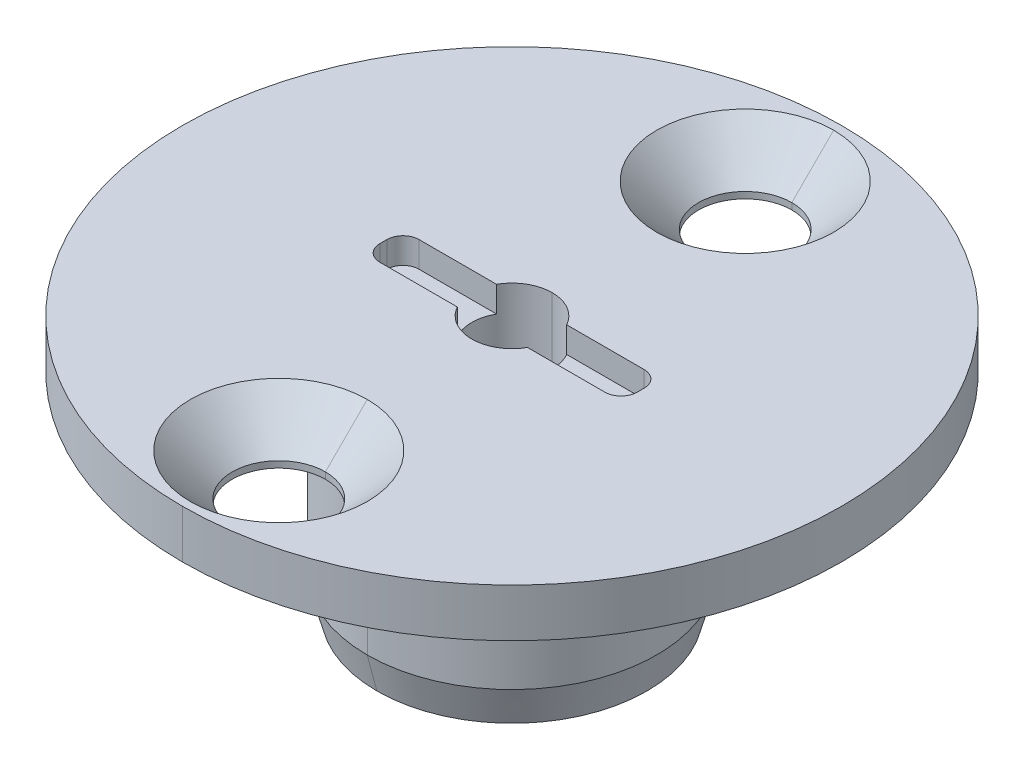
ISO-10303-21;
HEADER;
FILE_DESCRIPTION(('STEP AP214'),'2;1');
FILE_NAME('part.step','',(''),(''),'','','');
FILE_SCHEMA(('AUTOMOTIVE_DESIGN { 1 0 10303 214 1 1 1 1 }'));
ENDSEC;
DATA;
#1=APPLICATION_CONTEXT('core data for automotive mechanical design processes');
#2=APPLICATION_PROTOCOL_DEFINITION('international standard','automotive_design',2000,#1);
#3=PRODUCT_CONTEXT('',#1,'mechanical');
#4=PRODUCT('Part','Part','',(#3));
#5=PRODUCT_RELATED_PRODUCT_CATEGORY('part','',(#4));
#6=PRODUCT_DEFINITION_FORMATION('','',#4);
#7=PRODUCT_DEFINITION_CONTEXT('part definition',#1,'design');
#8=PRODUCT_DEFINITION('design','',#6,#7);
#9=PRODUCT_DEFINITION_SHAPE('','',#8);
#10=(LENGTH_UNIT() NAMED_UNIT(*) SI_UNIT(.MILLI.,.METRE.));
#11=(NAMED_UNIT(*) PLANE_ANGLE_UNIT() SI_UNIT($,.RADIAN.));
#12=(NAMED_UNIT(*) SI_UNIT($,.STERADIAN.) SOLID_ANGLE_UNIT());
#13=UNCERTAINTY_MEASURE_WITH_UNIT(LENGTH_MEASURE(1.E-05),#10,'distance_accuracy_value','');
#14=(GEOMETRIC_REPRESENTATION_CONTEXT(3) GLOBAL_UNCERTAINTY_ASSIGNED_CONTEXT((#13)) GLOBAL_UNIT_ASSIGNED_CONTEXT((#10,
#11,#12)) REPRESENTATION_CONTEXT('',''));
#15=CARTESIAN_POINT('',(0.,0.,0.));
#16=DIRECTION('',(0.,0.,1.));
#17=DIRECTION('',(1.,0.,0.));
#18=AXIS2_PLACEMENT_3D('',#15,#16,#17);
#19=CARTESIAN_POINT('',(0.,8.,0.));
#20=DIRECTION('',(0.,1.,0.));
#21=DIRECTION('',(0.,0.,1.));
#22=AXIS2_PLACEMENT_3D('',#19,#20,#21);
#23=CYLINDRICAL_SURFACE('',#22,1.25);
#24=CARTESIAN_POINT('',(0.,6.,0.));
#25=DIRECTION('',(0.,-1.,0.));
#26=DIRECTION('',(0.,0.,-1.));
#27=AXIS2_PLACEMENT_3D('',#24,#25,#26);
#28=CIRCLE('',#27,1.25);
#29=CARTESIAN_POINT('',(0.,6.,1.25));
#30=VERTEX_POINT('',#29);
#31=CARTESIAN_POINT('',(0.,6.,-1.25));
#32=VERTEX_POINT('',#31);
#33=EDGE_CURVE('E11',#30,#32,#28,.T.);
#34=ORIENTED_EDGE('',*,*,#33,.T.);
#35=DIRECTION('',(0.,1.,0.));
#36=VECTOR('',#35,1.);
#37=CARTESIAN_POINT('',(0.,8.,-1.25));
#38=LINE('',#37,#36);
#39=CARTESIAN_POINT('',(0.,8.,-1.25));
#40=VERTEX_POINT('',#39);
#41=EDGE_CURVE('E27',#32,#40,#38,.T.);
#42=ORIENTED_EDGE('',*,*,#41,.T.);
#43=CARTESIAN_POINT('',(0.,8.,0.));
#44=DIRECTION('',(0.,1.,0.));
#45=DIRECTION('',(0.,0.,1.));
#46=AXIS2_PLACEMENT_3D('',#43,#44,#45);
#47=CIRCLE('',#46,1.25);
#48=CARTESIAN_POINT('',(-1.09105453575887,8.,-0.61));
#49=VERTEX_POINT('',#48);
#50=EDGE_CURVE('E340',#40,#49,#47,.T.);
#51=ORIENTED_EDGE('',*,*,#50,.T.);
#52=DIRECTION('',(0.,-1.,0.));
#53=VECTOR('',#52,1.);
#54=CARTESIAN_POINT('',(-1.09105453575887,8.,-0.61));
#55=LINE('',#54,#53);
#56=CARTESIAN_POINT('',(-1.09105453575887,7.2,-0.61));
#57=VERTEX_POINT('',#56);
#58=EDGE_CURVE('E285',#49,#57,#55,.T.);
#59=ORIENTED_EDGE('',*,*,#58,.T.);
#60=CARTESIAN_POINT('',(0.,7.2,0.));
#61=DIRECTION('',(0.,-1.,0.));
#62=DIRECTION('',(0.,0.,1.));
#63=AXIS2_PLACEMENT_3D('',#60,#61,#62);
#64=CIRCLE('',#63,1.25);
#65=CARTESIAN_POINT('',(-1.09105453575887,7.2,0.61));
#66=VERTEX_POINT('',#65);
#67=EDGE_CURVE('E280',#66,#57,#64,.T.);
#68=ORIENTED_EDGE('',*,*,#67,.F.);
#69=DIRECTION('',(0.,1.,0.));
#70=VECTOR('',#69,1.);
#71=CARTESIAN_POINT('',(-1.09105453575887,8.,0.61));
#72=LINE('',#71,#70);
#73=CARTESIAN_POINT('',(-1.09105453575887,8.,0.61));
#74=VERTEX_POINT('',#73);
#75=EDGE_CURVE('E274',#66,#74,#72,.T.);
#76=ORIENTED_EDGE('',*,*,#75,.T.);
#77=CARTESIAN_POINT('',(0.,8.,0.));
#78=DIRECTION('',(0.,1.,0.));
#79=DIRECTION('',(0.,0.,1.));
#80=AXIS2_PLACEMENT_3D('',#77,#78,#79);
#81=CIRCLE('',#80,1.25);
#82=CARTESIAN_POINT('',(0.,8.,1.25));
#83=VERTEX_POINT('',#82);
#84=EDGE_CURVE('E261',#74,#83,#81,.T.);
#85=ORIENTED_EDGE('',*,*,#84,.T.);
#86=DIRECTION('',(0.,1.,0.));
#87=VECTOR('',#86,1.);
#88=CARTESIAN_POINT('',(0.,8.,1.25));
#89=LINE('',#88,#87);
#90=EDGE_CURVE('E361',#30,#83,#89,.T.);
#91=ORIENTED_EDGE('',*,*,#90,.F.);
#92=EDGE_LOOP('',(#34,#42,#51,#59,#68,#76,#85,#91));
#93=FACE_BOUND('',#92,.T.);
#94=ADVANCED_FACE('F16',(#93),#23,.F.);
#95=CARTESIAN_POINT('',(0.,8.,7.25));
#96=DIRECTION('',(0.,1.,0.));
#97=DIRECTION('',(0.,0.,1.));
#98=AXIS2_PLACEMENT_3D('',#95,#96,#97);
#99=CONICAL_SURFACE('',#98,2.75,0.785398163397449);
#100=CARTESIAN_POINT('',(0.,6.7,7.25));
#101=DIRECTION('',(0.,1.,0.));
#102=DIRECTION('',(0.,0.,1.));
#103=AXIS2_PLACEMENT_3D('',#100,#101,#102);
#104=CIRCLE('',#103,1.45);
#105=CARTESIAN_POINT('',(0.,6.7,5.8));
#106=VERTEX_POINT('',#105);
#107=CARTESIAN_POINT('',(0.,6.7,8.7));
#108=VERTEX_POINT('',#107);
#109=EDGE_CURVE('E388',#106,#108,#104,.T.);
#110=ORIENTED_EDGE('',*,*,#109,.F.);
#111=DIRECTION('',(0.,0.707106781186547,-0.707106781186548));
#112=VECTOR('',#111,1.);
#113=CARTESIAN_POINT('',(0.,8.,4.5));
#114=LINE('',#113,#112);
#115=CARTESIAN_POINT('',(0.,8.,4.5));
#116=VERTEX_POINT('',#115);
#117=EDGE_CURVE('E275',#106,#116,#114,.T.);
#118=ORIENTED_EDGE('',*,*,#117,.T.);
#119=CARTESIAN_POINT('',(0.,8.,7.25));
#120=DIRECTION('',(0.,1.,0.));
#121=DIRECTION('',(0.,0.,1.));
#122=AXIS2_PLACEMENT_3D('',#119,#120,#121);
#123=CIRCLE('',#122,2.75);
#124=CARTESIAN_POINT('',(0.,8.,10.));
#125=VERTEX_POINT('',#124);
#126=EDGE_CURVE('E325',#116,#125,#123,.T.);
#127=ORIENTED_EDGE('',*,*,#126,.T.);
#128=DIRECTION('',(0.,0.707106781186547,0.707106781186548));
#129=VECTOR('',#128,1.);
#130=CARTESIAN_POINT('',(0.,8.,10.));
#131=LINE('',#130,#129);
#132=EDGE_CURVE('E409',#108,#125,#131,.T.);
#133=ORIENTED_EDGE('',*,*,#132,.F.);
#134=EDGE_LOOP('',(#110,#118,#127,#133));
#135=FACE_BOUND('',#134,.T.);
#136=ADVANCED_FACE('F992',(#135),#99,.F.);
#137=CARTESIAN_POINT('',(0.,8.,7.25));
#138=DIRECTION('',(0.,1.,0.));
#139=DIRECTION('',(0.,0.,1.));
#140=AXIS2_PLACEMENT_3D('',#137,#138,#139);
#141=CYLINDRICAL_SURFACE('',#140,1.45);
#142=CARTESIAN_POINT('',(0.,6.5,7.25));
#143=DIRECTION('',(0.,-1.,0.));
#144=DIRECTION('',(0.,0.,-1.));
#145=AXIS2_PLACEMENT_3D('',#142,#143,#144);
#146=CIRCLE('',#145,1.45);
#147=CARTESIAN_POINT('',(0.,6.5,8.7));
#148=VERTEX_POINT('',#147);
#149=CARTESIAN_POINT('',(0.,6.5,5.8));
#150=VERTEX_POINT('',#149);
#151=EDGE_CURVE('E321',#148,#150,#146,.T.);
#152=ORIENTED_EDGE('',*,*,#151,.T.);
#153=DIRECTION('',(0.,1.,0.));
#154=VECTOR('',#153,1.);
#155=CARTESIAN_POINT('',(0.,8.,5.8));
#156=LINE('',#155,#154);
#157=EDGE_CURVE('E326',#150,#106,#156,.T.);
#158=ORIENTED_EDGE('',*,*,#157,.T.);
#159=ORIENTED_EDGE('',*,*,#109,.T.);
#160=DIRECTION('',(0.,1.,0.));
#161=VECTOR('',#160,1.);
#162=CARTESIAN_POINT('',(0.,8.,8.7));
#163=LINE('',#162,#161);
#164=EDGE_CURVE('E541',#148,#108,#163,.T.);
#165=ORIENTED_EDGE('',*,*,#164,.F.);
#166=EDGE_LOOP('',(#152,#158,#159,#165));
#167=FACE_BOUND('',#166,.T.);
#168=ADVANCED_FACE('F988',(#167),#141,.F.);
#169=CARTESIAN_POINT('',(0.,8.,-7.25));
#170=DIRECTION('',(0.,1.,0.));
#171=DIRECTION('',(0.,0.,1.));
#172=AXIS2_PLACEMENT_3D('',#169,#170,#171);
#173=CONICAL_SURFACE('',#172,2.75,0.785398163397449);
#174=CARTESIAN_POINT('',(0.,6.7,-7.25));
#175=DIRECTION('',(0.,1.,0.));
#176=DIRECTION('',(0.,0.,1.));
#177=AXIS2_PLACEMENT_3D('',#174,#175,#176);
#178=CIRCLE('',#177,1.45);
#179=CARTESIAN_POINT('',(0.,6.7,-8.7));
#180=VERTEX_POINT('',#179);
#181=CARTESIAN_POINT('',(0.,6.7,-5.8));
#182=VERTEX_POINT('',#181);
#183=EDGE_CURVE('E401',#180,#182,#178,.T.);
#184=ORIENTED_EDGE('',*,*,#183,.F.);
#185=DIRECTION('',(0.,0.707106781186547,-0.707106781186548));
#186=VECTOR('',#185,1.);
#187=CARTESIAN_POINT('',(0.,8.,-10.));
#188=LINE('',#187,#186);
#189=CARTESIAN_POINT('',(0.,8.,-10.));
#190=VERTEX_POINT('',#189);
#191=EDGE_CURVE('E392',#180,#190,#188,.T.);
#192=ORIENTED_EDGE('',*,*,#191,.T.);
#193=CARTESIAN_POINT('',(0.,8.,-7.25));
#194=DIRECTION('',(0.,1.,0.));
#195=DIRECTION('',(0.,0.,1.));
#196=AXIS2_PLACEMENT_3D('',#193,#194,#195);
#197=CIRCLE('',#196,2.75);
#198=CARTESIAN_POINT('',(0.,8.,-4.5));
#199=VERTEX_POINT('',#198);
#200=EDGE_CURVE('E405',#190,#199,#197,.T.);
#201=ORIENTED_EDGE('',*,*,#200,.T.);
#202=DIRECTION('',(0.,0.707106781186547,0.707106781186548));
#203=VECTOR('',#202,1.);
#204=CARTESIAN_POINT('',(0.,8.,-4.5));
#205=LINE('',#204,#203);
#206=EDGE_CURVE('E305',#182,#199,#205,.T.);
#207=ORIENTED_EDGE('',*,*,#206,.F.);
#208=EDGE_LOOP('',(#184,#192,#201,#207));
#209=FACE_BOUND('',#208,.T.);
#210=ADVANCED_FACE('F593',(#209),#173,.F.);
#211=CARTESIAN_POINT('',(0.,8.,-7.25));
#212=DIRECTION('',(0.,1.,0.));
#213=DIRECTION('',(0.,0.,1.));
#214=AXIS2_PLACEMENT_3D('',#211,#212,#213);
#215=CYLINDRICAL_SURFACE('',#214,1.45);
#216=CARTESIAN_POINT('',(0.,6.5,-7.25));
#217=DIRECTION('',(0.,-1.,0.));
#218=DIRECTION('',(0.,0.,-1.));
#219=AXIS2_PLACEMENT_3D('',#216,#217,#218);
#220=CIRCLE('',#219,1.45);
#221=CARTESIAN_POINT('',(0.,6.5,-5.8));
#222=VERTEX_POINT('',#221);
#223=CARTESIAN_POINT('',(0.,6.5,-8.7));
#224=VERTEX_POINT('',#223);
#225=EDGE_CURVE('E400',#222,#224,#220,.T.);
#226=ORIENTED_EDGE('',*,*,#225,.T.);
#227=DIRECTION('',(0.,1.,0.));
#228=VECTOR('',#227,1.);
#229=CARTESIAN_POINT('',(0.,8.,-8.7));
#230=LINE('',#229,#228);
#231=EDGE_CURVE('E396',#224,#180,#230,.T.);
#232=ORIENTED_EDGE('',*,*,#231,.T.);
#233=ORIENTED_EDGE('',*,*,#183,.T.);
#234=DIRECTION('',(0.,1.,0.));
#235=VECTOR('',#234,1.);
#236=CARTESIAN_POINT('',(0.,8.,-5.8));
#237=LINE('',#236,#235);
#238=EDGE_CURVE('E446',#222,#182,#237,.T.);
#239=ORIENTED_EDGE('',*,*,#238,.F.);
#240=EDGE_LOOP('',(#226,#232,#233,#239));
#241=FACE_BOUND('',#240,.T.);
#242=ADVANCED_FACE('F955',(#241),#215,.F.);
#243=CARTESIAN_POINT('',(0.,1.11961524227067,0.));
#244=DIRECTION('',(0.,-1.,0.));
#245=DIRECTION('',(0.,0.,-1.));
#246=AXIS2_PLACEMENT_3D('',#243,#244,#245);
#247=CONICAL_SURFACE('',#246,3.175,0.26179938779915);
#248=CARTESIAN_POINT('',(0.,1.11961524227067,0.));
#249=DIRECTION('',(0.,-1.,0.));
#250=DIRECTION('',(0.,0.,-1.));
#251=AXIS2_PLACEMENT_3D('',#248,#249,#250);
#252=CIRCLE('',#251,3.175);
#253=CARTESIAN_POINT('',(0.,1.11961524227067,3.175));
#254=VERTEX_POINT('',#253);
#255=CARTESIAN_POINT('',(0.,1.11961524227067,-3.175));
#256=VERTEX_POINT('',#255);
#257=EDGE_CURVE('E367',#254,#256,#252,.T.);
#258=ORIENTED_EDGE('',*,*,#257,.F.);
#259=DIRECTION('',(0.,-0.965925826289068,0.258819045102521));
#260=VECTOR('',#259,1.);
#261=CARTESIAN_POINT('',(0.,1.11961524227067,3.175));
#262=LINE('',#261,#260);
#263=CARTESIAN_POINT('',(0.,0.,3.475));
#264=VERTEX_POINT('',#263);
#265=EDGE_CURVE('E571',#254,#264,#262,.T.);
#266=ORIENTED_EDGE('',*,*,#265,.T.);
#267=CARTESIAN_POINT('',(0.,0.,0.));
#268=DIRECTION('',(0.,1.,0.));
#269=DIRECTION('',(0.,0.,-1.));
#270=AXIS2_PLACEMENT_3D('',#267,#268,#269);
#271=CIRCLE('',#270,3.475);
#272=CARTESIAN_POINT('',(0.,0.,-3.475));
#273=VERTEX_POINT('',#272);
#274=EDGE_CURVE('E459',#273,#264,#271,.T.);
#275=ORIENTED_EDGE('',*,*,#274,.F.);
#276=DIRECTION('',(0.,-0.965925826289068,-0.258819045102521));
#277=VECTOR('',#276,1.);
#278=CARTESIAN_POINT('',(0.,1.11961524227067,-3.175));
#279=LINE('',#278,#277);
#280=EDGE_CURVE('E445',#256,#273,#279,.T.);
#281=ORIENTED_EDGE('',*,*,#280,.F.);
#282=EDGE_LOOP('',(#258,#266,#275,#281));
#283=FACE_BOUND('',#282,.T.);
#284=ADVANCED_FACE('F950',(#283),#247,.F.);
#285=CARTESIAN_POINT('',(0.,0.,0.));
#286=DIRECTION('',(0.,1.,0.));
#287=DIRECTION('',(0.,0.,1.));
#288=AXIS2_PLACEMENT_3D('',#285,#286,#287);
#289=CONICAL_SURFACE('',#288,4.2,0.26179938779915);
#290=CARTESIAN_POINT('',(0.,0.,0.));
#291=DIRECTION('',(0.,-1.,0.));
#292=DIRECTION('',(0.,0.,-1.));
#293=AXIS2_PLACEMENT_3D('',#290,#291,#292);
#294=CIRCLE('',#293,4.2);
#295=CARTESIAN_POINT('',(0.,0.,-4.2));
#296=VERTEX_POINT('',#295);
#297=CARTESIAN_POINT('',(0.,0.,4.2));
#298=VERTEX_POINT('',#297);
#299=EDGE_CURVE('E416',#296,#298,#294,.T.);
#300=ORIENTED_EDGE('',*,*,#299,.F.);
#301=DIRECTION('',(0.,0.965925826289068,-0.258819045102522));
#302=VECTOR('',#301,1.);
#303=CARTESIAN_POINT('',(0.,0.,-4.2));
#304=LINE('',#303,#302);
#305=CARTESIAN_POINT('',(0.,1.11961524227064,-4.5));
#306=VERTEX_POINT('',#305);
#307=EDGE_CURVE('E499',#296,#306,#304,.T.);
#308=ORIENTED_EDGE('',*,*,#307,.T.);
#309=CARTESIAN_POINT('',(0.,1.11961524227064,0.));
#310=DIRECTION('',(0.,1.,0.));
#311=DIRECTION('',(0.,0.,-1.));
#312=AXIS2_PLACEMENT_3D('',#309,#310,#311);
#313=CIRCLE('',#312,4.5);
#314=CARTESIAN_POINT('',(0.,1.11961524227064,4.5));
#315=VERTEX_POINT('',#314);
#316=EDGE_CURVE('E382',#315,#306,#313,.T.);
#317=ORIENTED_EDGE('',*,*,#316,.F.);
#318=DIRECTION('',(0.,0.965925826289068,0.258819045102522));
#319=VECTOR('',#318,1.);
#320=CARTESIAN_POINT('',(0.,0.,4.2));
#321=LINE('',#320,#319);
#322=EDGE_CURVE('E450',#298,#315,#321,.T.);
#323=ORIENTED_EDGE('',*,*,#322,.F.);
#324=EDGE_LOOP('',(#300,#308,#317,#323));
#325=FACE_BOUND('',#324,.T.);
#326=ADVANCED_FACE('F954',(#325),#289,.T.);
#327=CARTESIAN_POINT('',(0.,0.,0.));
#328=DIRECTION('',(0.,-1.,0.));
#329=DIRECTION('',(0.,0.,-1.));
#330=AXIS2_PLACEMENT_3D('',#327,#328,#329);
#331=CYLINDRICAL_SURFACE('',#330,4.5);
#332=CARTESIAN_POINT('',(0.,6.5,0.));
#333=DIRECTION('',(0.,-1.,0.));
#334=DIRECTION('',(0.,0.,-1.));
#335=AXIS2_PLACEMENT_3D('',#332,#333,#334);
#336=CIRCLE('',#335,4.5);
#337=CARTESIAN_POINT('',(0.,6.5,-4.5));
#338=VERTEX_POINT('',#337);
#339=CARTESIAN_POINT('',(0.,6.5,4.5));
#340=VERTEX_POINT('',#339);
#341=EDGE_CURVE('E495',#338,#340,#336,.T.);
#342=ORIENTED_EDGE('',*,*,#341,.T.);
#343=DIRECTION('',(0.,-1.,0.));
#344=VECTOR('',#343,1.);
#345=CARTESIAN_POINT('',(0.,0.,4.5));
#346=LINE('',#345,#344);
#347=EDGE_CURVE('E472',#340,#315,#346,.T.);
#348=ORIENTED_EDGE('',*,*,#347,.T.);
#349=ORIENTED_EDGE('',*,*,#316,.T.);
#350=DIRECTION('',(0.,-1.,0.));
#351=VECTOR('',#350,1.);
#352=CARTESIAN_POINT('',(0.,0.,-4.5));
#353=LINE('',#352,#351);
#354=EDGE_CURVE('E422',#338,#306,#353,.T.);
#355=ORIENTED_EDGE('',*,*,#354,.F.);
#356=EDGE_LOOP('',(#342,#348,#349,#355));
#357=FACE_BOUND('',#356,.T.);
#358=ADVANCED_FACE('F902',(#357),#331,.T.);
#359=CARTESIAN_POINT('',(0.,0.,0.));
#360=DIRECTION('',(0.,-1.,0.));
#361=DIRECTION('',(0.,0.,-1.));
#362=AXIS2_PLACEMENT_3D('',#359,#360,#361);
#363=CYLINDRICAL_SURFACE('',#362,10.25);
#364=CARTESIAN_POINT('',(0.,8.,0.));
#365=DIRECTION('',(0.,-1.,0.));
#366=DIRECTION('',(0.,0.,-1.));
#367=AXIS2_PLACEMENT_3D('',#364,#365,#366);
#368=CIRCLE('',#367,10.25);
#369=CARTESIAN_POINT('',(0.,8.,-10.25));
#370=VERTEX_POINT('',#369);
#371=CARTESIAN_POINT('',(0.,8.,10.25));
#372=VERTEX_POINT('',#371);
#373=EDGE_CURVE('E378',#370,#372,#368,.T.);
#374=ORIENTED_EDGE('',*,*,#373,.T.);
#375=DIRECTION('',(0.,-1.,0.));
#376=VECTOR('',#375,1.);
#377=CARTESIAN_POINT('',(0.,0.,10.25));
#378=LINE('',#377,#376);
#379=CARTESIAN_POINT('',(0.,6.5,10.25));
#380=VERTEX_POINT('',#379);
#381=EDGE_CURVE('E383',#372,#380,#378,.T.);
#382=ORIENTED_EDGE('',*,*,#381,.T.);
#383=CARTESIAN_POINT('',(0.,6.5,0.));
#384=DIRECTION('',(0.,-1.,0.));
#385=DIRECTION('',(0.,0.,-1.));
#386=AXIS2_PLACEMENT_3D('',#383,#384,#385);
#387=CIRCLE('',#386,10.25);
#388=CARTESIAN_POINT('',(0.,6.5,-10.25));
#389=VERTEX_POINT('',#388);
#390=EDGE_CURVE('E432',#389,#380,#387,.T.);
#391=ORIENTED_EDGE('',*,*,#390,.F.);
#392=DIRECTION('',(0.,-1.,0.));
#393=VECTOR('',#392,1.);
#394=CARTESIAN_POINT('',(0.,0.,-10.25));
#395=LINE('',#394,#393);
#396=EDGE_CURVE('E427',#370,#389,#395,.T.);
#397=ORIENTED_EDGE('',*,*,#396,.F.);
#398=EDGE_LOOP('',(#374,#382,#391,#397));
#399=FACE_BOUND('',#398,.T.);
#400=ADVANCED_FACE('F833',(#399),#363,.T.);
#401=CARTESIAN_POINT('',(0.,0.,0.));
#402=DIRECTION('',(0.,-1.,0.));
#403=DIRECTION('',(0.,0.,-1.));
#404=AXIS2_PLACEMENT_3D('',#401,#402,#403);
#405=CYLINDRICAL_SURFACE('',#404,3.175);
#406=CARTESIAN_POINT('',(0.,6.,0.));
#407=DIRECTION('',(0.,-1.,0.));
#408=DIRECTION('',(0.,0.,-1.));
#409=AXIS2_PLACEMENT_3D('',#406,#407,#408);
#410=CIRCLE('',#409,3.175);
#411=CARTESIAN_POINT('',(0.,6.,3.175));
#412=VERTEX_POINT('',#411);
#413=CARTESIAN_POINT('',(0.,6.,-3.175));
#414=VERTEX_POINT('',#413);
#415=EDGE_CURVE('E421',#412,#414,#410,.T.);
#416=ORIENTED_EDGE('',*,*,#415,.F.);
#417=DIRECTION('',(0.,-1.,0.));
#418=VECTOR('',#417,1.);
#419=CARTESIAN_POINT('',(0.,0.,3.175));
#420=LINE('',#419,#418);
#421=EDGE_CURVE('E371',#412,#254,#420,.T.);
#422=ORIENTED_EDGE('',*,*,#421,.T.);
#423=ORIENTED_EDGE('',*,*,#257,.T.);
#424=DIRECTION('',(0.,-1.,0.));
#425=VECTOR('',#424,1.);
#426=CARTESIAN_POINT('',(0.,0.,-3.175));
#427=LINE('',#426,#425);
#428=EDGE_CURVE('E334',#414,#256,#427,.T.);
#429=ORIENTED_EDGE('',*,*,#428,.F.);
#430=EDGE_LOOP('',(#416,#422,#423,#429));
#431=FACE_BOUND('',#430,.T.);
#432=ADVANCED_FACE('F828',(#431),#405,.F.);
#433=CARTESIAN_POINT('',(4.5,0.,0.));
#434=DIRECTION('',(0.,-1.,0.));
#435=DIRECTION('',(0.,0.,-1.));
#436=AXIS2_PLACEMENT_3D('',#433,#434,#435);
#437=PLANE('',#436);
#438=CARTESIAN_POINT('',(0.,0.,0.));
#439=DIRECTION('',(0.,-1.,0.));
#440=DIRECTION('',(0.,0.,-1.));
#441=AXIS2_PLACEMENT_3D('',#438,#439,#440);
#442=CIRCLE('',#441,4.2);
#443=EDGE_CURVE('E372',#298,#296,#442,.T.);
#444=ORIENTED_EDGE('',*,*,#443,.T.);
#445=ORIENTED_EDGE('',*,*,#299,.T.);
#446=EDGE_LOOP('',(#444,#445));
#447=FACE_BOUND('',#446,.T.);
#448=ORIENTED_EDGE('',*,*,#274,.T.);
#449=CARTESIAN_POINT('',(0.,0.,0.));
#450=DIRECTION('',(0.,1.,0.));
#451=DIRECTION('',(0.,0.,-1.));
#452=AXIS2_PLACEMENT_3D('',#449,#450,#451);
#453=CIRCLE('',#452,3.475);
#454=EDGE_CURVE('E338',#264,#273,#453,.T.);
#455=ORIENTED_EDGE('',*,*,#454,.T.);
#456=EDGE_LOOP('',(#448,#455));
#457=FACE_BOUND('',#456,.T.);
#458=ADVANCED_FACE('F832',(#447,#457),#437,.T.);
#459=CARTESIAN_POINT('',(0.,0.,0.));
#460=DIRECTION('',(0.,-1.,0.));
#461=DIRECTION('',(0.,0.,-1.));
#462=AXIS2_PLACEMENT_3D('',#459,#460,#461);
#463=CYLINDRICAL_SURFACE('',#462,3.175);
#464=ORIENTED_EDGE('',*,*,#421,.F.);
#465=CARTESIAN_POINT('',(0.,6.,0.));
#466=DIRECTION('',(0.,-1.,0.));
#467=DIRECTION('',(0.,0.,-1.));
#468=AXIS2_PLACEMENT_3D('',#465,#466,#467);
#469=CIRCLE('',#468,3.175);
#470=EDGE_CURVE('E417',#414,#412,#469,.T.);
#471=ORIENTED_EDGE('',*,*,#470,.F.);
#472=ORIENTED_EDGE('',*,*,#428,.T.);
#473=CARTESIAN_POINT('',(0.,1.11961524227067,0.));
#474=DIRECTION('',(0.,-1.,0.));
#475=DIRECTION('',(0.,0.,-1.));
#476=AXIS2_PLACEMENT_3D('',#473,#474,#475);
#477=CIRCLE('',#476,3.175);
#478=EDGE_CURVE('E339',#256,#254,#477,.T.);
#479=ORIENTED_EDGE('',*,*,#478,.T.);
#480=EDGE_LOOP('',(#464,#471,#472,#479));
#481=FACE_BOUND('',#480,.T.);
#482=ADVANCED_FACE('F871',(#481),#463,.F.);
#483=CARTESIAN_POINT('',(3.175,6.,0.));
#484=DIRECTION('',(0.,-1.,0.));
#485=DIRECTION('',(0.,0.,-1.));
#486=AXIS2_PLACEMENT_3D('',#483,#484,#485);
#487=PLANE('',#486);
#488=ORIENTED_EDGE('',*,*,#470,.T.);
#489=ORIENTED_EDGE('',*,*,#415,.T.);
#490=EDGE_LOOP('',(#488,#489));
#491=FACE_BOUND('',#490,.T.);
#492=ORIENTED_EDGE('',*,*,#33,.F.);
#493=CARTESIAN_POINT('',(0.,6.,0.));
#494=DIRECTION('',(0.,-1.,0.));
#495=DIRECTION('',(0.,0.,-1.));
#496=AXIS2_PLACEMENT_3D('',#493,#494,#495);
#497=CIRCLE('',#496,1.25);
#498=EDGE_CURVE('E357',#32,#30,#497,.T.);
#499=ORIENTED_EDGE('',*,*,#498,.F.);
#500=EDGE_LOOP('',(#492,#499));
#501=FACE_BOUND('',#500,.T.);
#502=ADVANCED_FACE('F875',(#491,#501),#487,.T.);
#503=CARTESIAN_POINT('',(0.,8.,0.));
#504=DIRECTION('',(0.,1.,0.));
#505=DIRECTION('',(1.,0.,0.));
#506=AXIS2_PLACEMENT_3D('',#503,#504,#505);
#507=PLANE('',#506);
#508=ORIENTED_EDGE('',*,*,#373,.F.);
#509=CARTESIAN_POINT('',(0.,8.,0.));
#510=DIRECTION('',(0.,-1.,0.));
#511=DIRECTION('',(0.,0.,-1.));
#512=AXIS2_PLACEMENT_3D('',#509,#510,#511);
#513=CIRCLE('',#512,10.25);
#514=EDGE_CURVE('E431',#372,#370,#513,.T.);
#515=ORIENTED_EDGE('',*,*,#514,.F.);
#516=EDGE_LOOP('',(#508,#515));
#517=FACE_BOUND('',#516,.T.);
#518=DIRECTION('',(1.,0.,0.));
#519=VECTOR('',#518,1.);
#520=CARTESIAN_POINT('',(-3.5,8.,0.61));
#521=LINE('',#520,#519);
#522=CARTESIAN_POINT('',(-3.5,8.,0.61));
#523=VERTEX_POINT('',#522);
#524=EDGE_CURVE('E267',#523,#74,#521,.T.);
#525=ORIENTED_EDGE('',*,*,#524,.F.);
#526=CARTESIAN_POINT('',(-3.5,8.,0.11));
#527=DIRECTION('',(0.,1.,0.));
#528=DIRECTION('',(0.,0.,1.));
#529=AXIS2_PLACEMENT_3D('',#526,#527,#528);
#530=CIRCLE('',#529,0.5);
#531=CARTESIAN_POINT('',(-4.,8.,0.11));
#532=VERTEX_POINT('',#531);
#533=EDGE_CURVE('E362',#532,#523,#530,.T.);
#534=ORIENTED_EDGE('',*,*,#533,.F.);
#535=DIRECTION('',(0.,0.,1.));
#536=VECTOR('',#535,1.);
#537=CARTESIAN_POINT('',(-4.,8.,-0.11));
#538=LINE('',#537,#536);
#539=CARTESIAN_POINT('',(-4.,8.,-0.11));
#540=VERTEX_POINT('',#539);
#541=EDGE_CURVE('E307',#540,#532,#538,.T.);
#542=ORIENTED_EDGE('',*,*,#541,.F.);
#543=CARTESIAN_POINT('',(-3.5,8.,-0.11));
#544=DIRECTION('',(0.,1.,0.));
#545=DIRECTION('',(0.,0.,1.));
#546=AXIS2_PLACEMENT_3D('',#543,#544,#545);
#547=CIRCLE('',#546,0.5);
#548=CARTESIAN_POINT('',(-3.5,8.,-0.61));
#549=VERTEX_POINT('',#548);
#550=EDGE_CURVE('E504',#549,#540,#547,.T.);
#551=ORIENTED_EDGE('',*,*,#550,.F.);
#552=DIRECTION('',(-1.,0.,0.));
#553=VECTOR('',#552,1.);
#554=CARTESIAN_POINT('',(-3.5,8.,-0.61));
#555=LINE('',#554,#553);
#556=EDGE_CURVE('E291',#49,#549,#555,.T.);
#557=ORIENTED_EDGE('',*,*,#556,.F.);
#558=ORIENTED_EDGE('',*,*,#50,.F.);
#559=CARTESIAN_POINT('',(0.,8.,0.));
#560=DIRECTION('',(0.,1.,0.));
#561=DIRECTION('',(0.,0.,1.));
#562=AXIS2_PLACEMENT_3D('',#559,#560,#561);
#563=CIRCLE('',#562,1.25);
#564=CARTESIAN_POINT('',(1.09105453575887,8.,-0.61));
#565=VERTEX_POINT('',#564);
#566=EDGE_CURVE('E317',#565,#40,#563,.T.);
#567=ORIENTED_EDGE('',*,*,#566,.F.);
#568=DIRECTION('',(-1.,0.,0.));
#569=VECTOR('',#568,1.);
#570=CARTESIAN_POINT('',(-3.5,8.,-0.61));
#571=LINE('',#570,#569);
#572=CARTESIAN_POINT('',(3.5,8.,-0.61));
#573=VERTEX_POINT('',#572);
#574=EDGE_CURVE('E316',#573,#565,#571,.T.);
#575=ORIENTED_EDGE('',*,*,#574,.F.);
#576=CARTESIAN_POINT('',(3.5,8.,-0.11));
#577=DIRECTION('',(0.,1.,0.));
#578=DIRECTION('',(0.,0.,-1.));
#579=AXIS2_PLACEMENT_3D('',#576,#577,#578);
#580=CIRCLE('',#579,0.5);
#581=CARTESIAN_POINT('',(4.,8.,-0.11));
#582=VERTEX_POINT('',#581);
#583=EDGE_CURVE('E181',#582,#573,#580,.T.);
#584=ORIENTED_EDGE('',*,*,#583,.F.);
#585=DIRECTION('',(0.,0.,-1.));
#586=VECTOR('',#585,1.);
#587=CARTESIAN_POINT('',(4.,8.,-0.11));
#588=LINE('',#587,#586);
#589=CARTESIAN_POINT('',(4.,8.,0.11));
#590=VERTEX_POINT('',#589);
#591=EDGE_CURVE('E373',#590,#582,#588,.T.);
#592=ORIENTED_EDGE('',*,*,#591,.F.);
#593=CARTESIAN_POINT('',(3.5,8.,0.11));
#594=DIRECTION('',(0.,1.,0.));
#595=DIRECTION('',(0.,0.,1.));
#596=AXIS2_PLACEMENT_3D('',#593,#594,#595);
#597=CIRCLE('',#596,0.5);
#598=CARTESIAN_POINT('',(3.5,8.,0.61));
#599=VERTEX_POINT('',#598);
#600=EDGE_CURVE('E193',#599,#590,#597,.T.);
#601=ORIENTED_EDGE('',*,*,#600,.F.);
#602=DIRECTION('',(1.,0.,0.));
#603=VECTOR('',#602,1.);
#604=CARTESIAN_POINT('',(-3.5,8.,0.61));
#605=LINE('',#604,#603);
#606=CARTESIAN_POINT('',(1.09105453575887,8.,0.61));
#607=VERTEX_POINT('',#606);
#608=EDGE_CURVE('E376',#607,#599,#605,.T.);
#609=ORIENTED_EDGE('',*,*,#608,.F.);
#610=CARTESIAN_POINT('',(0.,8.,0.));
#611=DIRECTION('',(0.,1.,0.));
#612=DIRECTION('',(0.,0.,1.));
#613=AXIS2_PLACEMENT_3D('',#610,#611,#612);
#614=CIRCLE('',#613,1.25);
#615=EDGE_CURVE('E271',#83,#607,#614,.T.);
#616=ORIENTED_EDGE('',*,*,#615,.F.);
#617=ORIENTED_EDGE('',*,*,#84,.F.);
#618=EDGE_LOOP('',(#525,#534,#542,#551,#557,#558,#567,#575,#584,#592,#601,#609,#616,#617));
#619=FACE_BOUND('',#618,.T.);
#620=CARTESIAN_POINT('',(0.,8.,7.25));
#621=DIRECTION('',(0.,1.,0.));
#622=DIRECTION('',(0.,0.,1.));
#623=AXIS2_PLACEMENT_3D('',#620,#621,#622);
#624=CIRCLE('',#623,2.75);
#625=EDGE_CURVE('E360',#125,#116,#624,.T.);
#626=ORIENTED_EDGE('',*,*,#625,.F.);
#627=ORIENTED_EDGE('',*,*,#126,.F.);
#628=EDGE_LOOP('',(#626,#627));
#629=FACE_BOUND('',#628,.T.);
#630=CARTESIAN_POINT('',(0.,8.,-7.25));
#631=DIRECTION('',(0.,1.,0.));
#632=DIRECTION('',(0.,0.,1.));
#633=AXIS2_PLACEMENT_3D('',#630,#631,#632);
#634=CIRCLE('',#633,2.75);
#635=EDGE_CURVE('E437',#199,#190,#634,.T.);
#636=ORIENTED_EDGE('',*,*,#635,.F.);
#637=ORIENTED_EDGE('',*,*,#200,.F.);
#638=EDGE_LOOP('',(#636,#637));
#639=FACE_BOUND('',#638,.T.);
#640=ADVANCED_FACE('F263',(#517,#619,#629,#639),#507,.T.);
#641=CARTESIAN_POINT('',(0.,0.,0.));
#642=DIRECTION('',(0.,-1.,0.));
#643=DIRECTION('',(0.,0.,-1.));
#644=AXIS2_PLACEMENT_3D('',#641,#642,#643);
#645=CYLINDRICAL_SURFACE('',#644,10.25);
#646=ORIENTED_EDGE('',*,*,#381,.F.);
#647=ORIENTED_EDGE('',*,*,#514,.T.);
#648=ORIENTED_EDGE('',*,*,#396,.T.);
#649=CARTESIAN_POINT('',(0.,6.5,0.));
#650=DIRECTION('',(0.,-1.,0.));
#651=DIRECTION('',(0.,0.,-1.));
#652=AXIS2_PLACEMENT_3D('',#649,#650,#651);
#653=CIRCLE('',#652,10.25);
#654=EDGE_CURVE('E466',#380,#389,#653,.T.);
#655=ORIENTED_EDGE('',*,*,#654,.F.);
#656=EDGE_LOOP('',(#646,#647,#648,#655));
#657=FACE_BOUND('',#656,.T.);
#658=ADVANCED_FACE('F966',(#657),#645,.T.);
#659=CARTESIAN_POINT('',(10.25,6.5,0.));
#660=DIRECTION('',(0.,-1.,0.));
#661=DIRECTION('',(0.,0.,-1.));
#662=AXIS2_PLACEMENT_3D('',#659,#660,#661);
#663=PLANE('',#662);
#664=ORIENTED_EDGE('',*,*,#390,.T.);
#665=ORIENTED_EDGE('',*,*,#654,.T.);
#666=EDGE_LOOP('',(#664,#665));
#667=FACE_BOUND('',#666,.T.);
#668=ORIENTED_EDGE('',*,*,#151,.F.);
#669=CARTESIAN_POINT('',(0.,6.5,7.25));
#670=DIRECTION('',(0.,-1.,0.));
#671=DIRECTION('',(0.,0.,-1.));
#672=AXIS2_PLACEMENT_3D('',#669,#670,#671);
#673=CIRCLE('',#672,1.45);
#674=EDGE_CURVE('E20',#150,#148,#673,.T.);
#675=ORIENTED_EDGE('',*,*,#674,.F.);
#676=EDGE_LOOP('',(#668,#675));
#677=FACE_BOUND('',#676,.T.);
#678=ORIENTED_EDGE('',*,*,#225,.F.);
#679=CARTESIAN_POINT('',(0.,6.5,-7.25));
#680=DIRECTION('',(0.,-1.,0.));
#681=DIRECTION('',(0.,0.,-1.));
#682=AXIS2_PLACEMENT_3D('',#679,#680,#681);
#683=CIRCLE('',#682,1.45);
#684=EDGE_CURVE('E441',#224,#222,#683,.T.);
#685=ORIENTED_EDGE('',*,*,#684,.F.);
#686=EDGE_LOOP('',(#678,#685));
#687=FACE_BOUND('',#686,.T.);
#688=ORIENTED_EDGE('',*,*,#341,.F.);
#689=CARTESIAN_POINT('',(0.,6.5,0.));
#690=DIRECTION('',(0.,-1.,0.));
#691=DIRECTION('',(0.,0.,-1.));
#692=AXIS2_PLACEMENT_3D('',#689,#690,#691);
#693=CIRCLE('',#692,4.5);
#694=EDGE_CURVE('E424',#340,#338,#693,.T.);
#695=ORIENTED_EDGE('',*,*,#694,.F.);
#696=EDGE_LOOP('',(#688,#695));
#697=FACE_BOUND('',#696,.T.);
#698=ADVANCED_FACE('F961',(#667,#677,#687,#697),#663,.T.);
#699=CARTESIAN_POINT('',(0.,0.,0.));
#700=DIRECTION('',(0.,-1.,0.));
#701=DIRECTION('',(0.,0.,-1.));
#702=AXIS2_PLACEMENT_3D('',#699,#700,#701);
#703=CYLINDRICAL_SURFACE('',#702,4.5);
#704=ORIENTED_EDGE('',*,*,#347,.F.);
#705=ORIENTED_EDGE('',*,*,#694,.T.);
#706=ORIENTED_EDGE('',*,*,#354,.T.);
#707=CARTESIAN_POINT('',(0.,1.11961524227064,0.));
#708=DIRECTION('',(0.,1.,0.));
#709=DIRECTION('',(0.,0.,-1.));
#710=AXIS2_PLACEMENT_3D('',#707,#708,#709);
#711=CIRCLE('',#710,4.5);
#712=EDGE_CURVE('E425',#306,#315,#711,.T.);
#713=ORIENTED_EDGE('',*,*,#712,.T.);
#714=EDGE_LOOP('',(#704,#705,#706,#713));
#715=FACE_BOUND('',#714,.T.);
#716=ADVANCED_FACE('F965',(#715),#703,.T.);
#717=CARTESIAN_POINT('',(0.,0.,0.));
#718=DIRECTION('',(0.,1.,0.));
#719=DIRECTION('',(0.,0.,1.));
#720=AXIS2_PLACEMENT_3D('',#717,#718,#719);
#721=CONICAL_SURFACE('',#720,4.2,0.26179938779915);
#722=ORIENTED_EDGE('',*,*,#307,.F.);
#723=ORIENTED_EDGE('',*,*,#443,.F.);
#724=ORIENTED_EDGE('',*,*,#322,.T.);
#725=ORIENTED_EDGE('',*,*,#712,.F.);
#726=EDGE_LOOP('',(#722,#723,#724,#725));
#727=FACE_BOUND('',#726,.T.);
#728=ADVANCED_FACE('F1010',(#727),#721,.T.);
#729=CARTESIAN_POINT('',(0.,1.11961524227067,0.));
#730=DIRECTION('',(0.,-1.,0.));
#731=DIRECTION('',(0.,0.,-1.));
#732=AXIS2_PLACEMENT_3D('',#729,#730,#731);
#733=CONICAL_SURFACE('',#732,3.175,0.26179938779915);
#734=ORIENTED_EDGE('',*,*,#265,.F.);
#735=ORIENTED_EDGE('',*,*,#478,.F.);
#736=ORIENTED_EDGE('',*,*,#280,.T.);
#737=ORIENTED_EDGE('',*,*,#454,.F.);
#738=EDGE_LOOP('',(#734,#735,#736,#737));
#739=FACE_BOUND('',#738,.T.);
#740=ADVANCED_FACE('F912',(#739),#733,.F.);
#741=CARTESIAN_POINT('',(0.,8.,-7.25));
#742=DIRECTION('',(0.,1.,0.));
#743=DIRECTION('',(0.,0.,1.));
#744=AXIS2_PLACEMENT_3D('',#741,#742,#743);
#745=CYLINDRICAL_SURFACE('',#744,1.45);
#746=ORIENTED_EDGE('',*,*,#231,.F.);
#747=ORIENTED_EDGE('',*,*,#684,.T.);
#748=ORIENTED_EDGE('',*,*,#238,.T.);
#749=CARTESIAN_POINT('',(0.,6.7,-7.25));
#750=DIRECTION('',(0.,1.,0.));
#751=DIRECTION('',(0.,0.,1.));
#752=AXIS2_PLACEMENT_3D('',#749,#750,#751);
#753=CIRCLE('',#752,1.45);
#754=EDGE_CURVE('E507',#182,#180,#753,.T.);
#755=ORIENTED_EDGE('',*,*,#754,.T.);
#756=EDGE_LOOP('',(#746,#747,#748,#755));
#757=FACE_BOUND('',#756,.T.);
#758=ADVANCED_FACE('F908',(#757),#745,.F.);
#759=CARTESIAN_POINT('',(0.,8.,-7.25));
#760=DIRECTION('',(0.,1.,0.));
#761=DIRECTION('',(0.,0.,1.));
#762=AXIS2_PLACEMENT_3D('',#759,#760,#761);
#763=CONICAL_SURFACE('',#762,2.75,0.785398163397449);
#764=ORIENTED_EDGE('',*,*,#191,.F.);
#765=ORIENTED_EDGE('',*,*,#754,.F.);
#766=ORIENTED_EDGE('',*,*,#206,.T.);
#767=ORIENTED_EDGE('',*,*,#635,.T.);
#768=EDGE_LOOP('',(#764,#765,#766,#767));
#769=FACE_BOUND('',#768,.T.);
#770=ADVANCED_FACE('F598',(#769),#763,.F.);
#771=CARTESIAN_POINT('',(0.,8.,7.25));
#772=DIRECTION('',(0.,1.,0.));
#773=DIRECTION('',(0.,0.,1.));
#774=AXIS2_PLACEMENT_3D('',#771,#772,#773);
#775=CYLINDRICAL_SURFACE('',#774,1.45);
#776=ORIENTED_EDGE('',*,*,#157,.F.);
#777=ORIENTED_EDGE('',*,*,#674,.T.);
#778=ORIENTED_EDGE('',*,*,#164,.T.);
#779=CARTESIAN_POINT('',(0.,6.7,7.25));
#780=DIRECTION('',(0.,1.,0.));
#781=DIRECTION('',(0.,0.,1.));
#782=AXIS2_PLACEMENT_3D('',#779,#780,#781);
#783=CIRCLE('',#782,1.45);
#784=EDGE_CURVE('E412',#108,#106,#783,.T.);
#785=ORIENTED_EDGE('',*,*,#784,.T.);
#786=EDGE_LOOP('',(#776,#777,#778,#785));
#787=FACE_BOUND('',#786,.T.);
#788=ADVANCED_FACE('F855',(#787),#775,.F.);
#789=CARTESIAN_POINT('',(0.,8.,7.25));
#790=DIRECTION('',(0.,1.,0.));
#791=DIRECTION('',(0.,0.,1.));
#792=AXIS2_PLACEMENT_3D('',#789,#790,#791);
#793=CONICAL_SURFACE('',#792,2.75,0.785398163397449);
#794=ORIENTED_EDGE('',*,*,#117,.F.);
#795=ORIENTED_EDGE('',*,*,#784,.F.);
#796=ORIENTED_EDGE('',*,*,#132,.T.);
#797=ORIENTED_EDGE('',*,*,#625,.T.);
#798=EDGE_LOOP('',(#794,#795,#796,#797));
#799=FACE_BOUND('',#798,.T.);
#800=ADVANCED_FACE('F850',(#799),#793,.F.);
#801=CARTESIAN_POINT('',(0.,8.,0.));
#802=DIRECTION('',(0.,1.,0.));
#803=DIRECTION('',(0.,0.,1.));
#804=AXIS2_PLACEMENT_3D('',#801,#802,#803);
#805=CYLINDRICAL_SURFACE('',#804,1.25);
#806=ORIENTED_EDGE('',*,*,#41,.F.);
#807=ORIENTED_EDGE('',*,*,#498,.T.);
#808=ORIENTED_EDGE('',*,*,#90,.T.);
#809=ORIENTED_EDGE('',*,*,#615,.T.);
#810=DIRECTION('',(0.,-1.,0.));
#811=VECTOR('',#810,1.);
#812=CARTESIAN_POINT('',(1.09105453575887,8.,0.61));
#813=LINE('',#812,#811);
#814=CARTESIAN_POINT('',(1.09105453575887,7.2,0.61));
#815=VERTEX_POINT('',#814);
#816=EDGE_CURVE('E333',#607,#815,#813,.T.);
#817=ORIENTED_EDGE('',*,*,#816,.T.);
#818=CARTESIAN_POINT('',(0.,7.2,0.));
#819=DIRECTION('',(0.,-1.,0.));
#820=DIRECTION('',(0.,0.,1.));
#821=AXIS2_PLACEMENT_3D('',#818,#819,#820);
#822=CIRCLE('',#821,1.25);
#823=CARTESIAN_POINT('',(1.09105453575887,7.2,-0.61));
#824=VERTEX_POINT('',#823);
#825=EDGE_CURVE('E227',#824,#815,#822,.T.);
#826=ORIENTED_EDGE('',*,*,#825,.F.);
#827=DIRECTION('',(0.,1.,0.));
#828=VECTOR('',#827,1.);
#829=CARTESIAN_POINT('',(1.09105453575887,8.,-0.61));
#830=LINE('',#829,#828);
#831=EDGE_CURVE('E320',#824,#565,#830,.T.);
#832=ORIENTED_EDGE('',*,*,#831,.T.);
#833=ORIENTED_EDGE('',*,*,#566,.T.);
#834=EDGE_LOOP('',(#806,#807,#808,#809,#817,#826,#832,#833));
#835=FACE_BOUND('',#834,.T.);
#836=ADVANCED_FACE('F854',(#835),#805,.F.);
#837=CARTESIAN_POINT('',(3.5,7.2,0.11));
#838=DIRECTION('',(0.,1.,0.));
#839=DIRECTION('',(1.,0.,0.));
#840=AXIS2_PLACEMENT_3D('',#837,#838,#839);
#841=PLANE('',#840);
#842=ORIENTED_EDGE('',*,*,#825,.T.);
#843=DIRECTION('',(1.,0.,0.));
#844=VECTOR('',#843,1.);
#845=CARTESIAN_POINT('',(-3.5,7.2,0.61));
#846=LINE('',#845,#844);
#847=CARTESIAN_POINT('',(3.5,7.2,0.61));
#848=VERTEX_POINT('',#847);
#849=EDGE_CURVE('E329',#815,#848,#846,.T.);
#850=ORIENTED_EDGE('',*,*,#849,.T.);
#851=CARTESIAN_POINT('',(3.5,7.2,0.11));
#852=DIRECTION('',(0.,1.,0.));
#853=DIRECTION('',(0.,0.,1.));
#854=AXIS2_PLACEMENT_3D('',#851,#852,#853);
#855=CIRCLE('',#854,0.5);
#856=CARTESIAN_POINT('',(4.,7.2,0.11));
#857=VERTEX_POINT('',#856);
#858=EDGE_CURVE('E239',#848,#857,#855,.T.);
#859=ORIENTED_EDGE('',*,*,#858,.T.);
#860=DIRECTION('',(0.,0.,-1.));
#861=VECTOR('',#860,1.);
#862=CARTESIAN_POINT('',(4.,7.2,-0.11));
#863=LINE('',#862,#861);
#864=CARTESIAN_POINT('',(4.,7.2,-0.11));
#865=VERTEX_POINT('',#864);
#866=EDGE_CURVE('E330',#857,#865,#863,.T.);
#867=ORIENTED_EDGE('',*,*,#866,.T.);
#868=CARTESIAN_POINT('',(3.5,7.2,-0.11));
#869=DIRECTION('',(0.,1.,0.));
#870=DIRECTION('',(0.,0.,-1.));
#871=AXIS2_PLACEMENT_3D('',#868,#869,#870);
#872=CIRCLE('',#871,0.5);
#873=CARTESIAN_POINT('',(3.5,7.2,-0.61));
#874=VERTEX_POINT('',#873);
#875=EDGE_CURVE('E353',#865,#874,#872,.T.);
#876=ORIENTED_EDGE('',*,*,#875,.T.);
#877=DIRECTION('',(-1.,0.,0.));
#878=VECTOR('',#877,1.);
#879=CARTESIAN_POINT('',(-3.5,7.2,-0.61));
#880=LINE('',#879,#878);
#881=EDGE_CURVE('E315',#874,#824,#880,.T.);
#882=ORIENTED_EDGE('',*,*,#881,.T.);
#883=EDGE_LOOP('',(#842,#850,#859,#867,#876,#882));
#884=FACE_BOUND('',#883,.T.);
#885=ADVANCED_FACE('F944',(#884),#841,.T.);
#886=CARTESIAN_POINT('',(-3.5,7.2,-0.61));
#887=DIRECTION('',(0.,0.,-1.));
#888=DIRECTION('',(0.,-1.,0.));
#889=AXIS2_PLACEMENT_3D('',#886,#887,#888);
#890=PLANE('',#889);
#891=ORIENTED_EDGE('',*,*,#881,.F.);
#892=DIRECTION('',(0.,1.,0.));
#893=VECTOR('',#892,1.);
#894=CARTESIAN_POINT('',(3.5,7.2,-0.61));
#895=LINE('',#894,#893);
#896=EDGE_CURVE('E311',#874,#573,#895,.T.);
#897=ORIENTED_EDGE('',*,*,#896,.T.);
#898=ORIENTED_EDGE('',*,*,#574,.T.);
#899=ORIENTED_EDGE('',*,*,#831,.F.);
#900=EDGE_LOOP('',(#891,#897,#898,#899));
#901=FACE_BOUND('',#900,.T.);
#902=ADVANCED_FACE('F844',(#901),#890,.F.);
#903=CARTESIAN_POINT('',(-3.5,7.2,0.61));
#904=DIRECTION('',(0.,0.,1.));
#905=DIRECTION('',(1.,0.,0.));
#906=AXIS2_PLACEMENT_3D('',#903,#904,#905);
#907=PLANE('',#906);
#908=ORIENTED_EDGE('',*,*,#608,.T.);
#909=DIRECTION('',(0.,1.,0.));
#910=VECTOR('',#909,1.);
#911=CARTESIAN_POINT('',(3.5,7.2,0.61));
#912=LINE('',#911,#910);
#913=EDGE_CURVE('E298',#848,#599,#912,.T.);
#914=ORIENTED_EDGE('',*,*,#913,.F.);
#915=ORIENTED_EDGE('',*,*,#849,.F.);
#916=ORIENTED_EDGE('',*,*,#816,.F.);
#917=EDGE_LOOP('',(#908,#914,#915,#916));
#918=FACE_BOUND('',#917,.T.);
#919=ADVANCED_FACE('F839',(#918),#907,.F.);
#920=CARTESIAN_POINT('',(4.,7.2,-0.11));
#921=DIRECTION('',(1.,0.,0.));
#922=DIRECTION('',(0.,1.,0.));
#923=AXIS2_PLACEMENT_3D('',#920,#921,#922);
#924=PLANE('',#923);
#925=ORIENTED_EDGE('',*,*,#591,.T.);
#926=DIRECTION('',(0.,1.,0.));
#927=VECTOR('',#926,1.);
#928=CARTESIAN_POINT('',(4.,7.2,-0.11));
#929=LINE('',#928,#927);
#930=EDGE_CURVE('E384',#865,#582,#929,.T.);
#931=ORIENTED_EDGE('',*,*,#930,.F.);
#932=ORIENTED_EDGE('',*,*,#866,.F.);
#933=DIRECTION('',(0.,1.,0.));
#934=VECTOR('',#933,1.);
#935=CARTESIAN_POINT('',(4.,7.2,0.11));
#936=LINE('',#935,#934);
#937=EDGE_CURVE('E377',#857,#590,#936,.T.);
#938=ORIENTED_EDGE('',*,*,#937,.T.);
#939=EDGE_LOOP('',(#925,#931,#932,#938));
#940=FACE_BOUND('',#939,.T.);
#941=ADVANCED_FACE('F843',(#940),#924,.F.);
#942=CARTESIAN_POINT('',(3.5,7.2,-0.11));
#943=DIRECTION('',(0.,1.,0.));
#944=DIRECTION('',(0.,0.,1.));
#945=AXIS2_PLACEMENT_3D('',#942,#943,#944);
#946=CYLINDRICAL_SURFACE('',#945,0.5);
#947=ORIENTED_EDGE('',*,*,#583,.T.);
#948=ORIENTED_EDGE('',*,*,#896,.F.);
#949=ORIENTED_EDGE('',*,*,#875,.F.);
#950=ORIENTED_EDGE('',*,*,#930,.T.);
#951=EDGE_LOOP('',(#947,#948,#949,#950));
#952=FACE_BOUND('',#951,.T.);
#953=ADVANCED_FACE('F884',(#952),#946,.F.);
#954=CARTESIAN_POINT('',(3.5,7.2,0.11));
#955=DIRECTION('',(0.,1.,0.));
#956=DIRECTION('',(0.,0.,1.));
#957=AXIS2_PLACEMENT_3D('',#954,#955,#956);
#958=CYLINDRICAL_SURFACE('',#957,0.5);
#959=ORIENTED_EDGE('',*,*,#600,.T.);
#960=ORIENTED_EDGE('',*,*,#937,.F.);
#961=ORIENTED_EDGE('',*,*,#858,.F.);
#962=ORIENTED_EDGE('',*,*,#913,.T.);
#963=EDGE_LOOP('',(#959,#960,#961,#962));
#964=FACE_BOUND('',#963,.T.);
#965=ADVANCED_FACE('F1001',(#964),#958,.F.);
#966=CARTESIAN_POINT('',(-3.5,7.2,0.61));
#967=DIRECTION('',(0.,0.,1.));
#968=DIRECTION('',(1.,0.,0.));
#969=AXIS2_PLACEMENT_3D('',#966,#967,#968);
#970=PLANE('',#969);
#971=DIRECTION('',(1.,0.,0.));
#972=VECTOR('',#971,1.);
#973=CARTESIAN_POINT('',(-3.5,7.2,0.61));
#974=LINE('',#973,#972);
#975=CARTESIAN_POINT('',(-3.5,7.2,0.61));
#976=VERTEX_POINT('',#975);
#977=EDGE_CURVE('E366',#976,#66,#974,.T.);
#978=ORIENTED_EDGE('',*,*,#977,.F.);
#979=DIRECTION('',(0.,1.,0.));
#980=VECTOR('',#979,1.);
#981=CARTESIAN_POINT('',(-3.5,7.2,0.61));
#982=LINE('',#981,#980);
#983=EDGE_CURVE('E289',#976,#523,#982,.T.);
#984=ORIENTED_EDGE('',*,*,#983,.T.);
#985=ORIENTED_EDGE('',*,*,#524,.T.);
#986=ORIENTED_EDGE('',*,*,#75,.F.);
#987=EDGE_LOOP('',(#978,#984,#985,#986));
#988=FACE_BOUND('',#987,.T.);
#989=ADVANCED_FACE('F287',(#988),#970,.F.);
#990=CARTESIAN_POINT('',(-3.5,7.2,-0.61));
#991=DIRECTION('',(0.,0.,-1.));
#992=DIRECTION('',(0.,-1.,0.));
#993=AXIS2_PLACEMENT_3D('',#990,#991,#992);
#994=PLANE('',#993);
#995=ORIENTED_EDGE('',*,*,#556,.T.);
#996=DIRECTION('',(0.,1.,0.));
#997=VECTOR('',#996,1.);
#998=CARTESIAN_POINT('',(-3.5,7.2,-0.61));
#999=LINE('',#998,#997);
#1000=CARTESIAN_POINT('',(-3.5,7.2,-0.61));
#1001=VERTEX_POINT('',#1000);
#1002=EDGE_CURVE('E500',#1001,#549,#999,.T.);
#1003=ORIENTED_EDGE('',*,*,#1002,.F.);
#1004=DIRECTION('',(-1.,0.,0.));
#1005=VECTOR('',#1004,1.);
#1006=CARTESIAN_POINT('',(-3.5,7.2,-0.61));
#1007=LINE('',#1006,#1005);
#1008=EDGE_CURVE('E348',#57,#1001,#1007,.T.);
#1009=ORIENTED_EDGE('',*,*,#1008,.F.);
#1010=ORIENTED_EDGE('',*,*,#58,.F.);
#1011=EDGE_LOOP('',(#995,#1003,#1009,#1010));
#1012=FACE_BOUND('',#1011,.T.);
#1013=ADVANCED_FACE('F1042',(#1012),#994,.F.);
#1014=CARTESIAN_POINT('',(3.5,7.2,0.11));
#1015=DIRECTION('',(0.,1.,0.));
#1016=DIRECTION('',(1.,0.,0.));
#1017=AXIS2_PLACEMENT_3D('',#1014,#1015,#1016);
#1018=PLANE('',#1017);
#1019=ORIENTED_EDGE('',*,*,#67,.T.);
#1020=ORIENTED_EDGE('',*,*,#1008,.T.);
#1021=CARTESIAN_POINT('',(-3.5,7.2,-0.11));
#1022=DIRECTION('',(0.,1.,0.));
#1023=DIRECTION('',(0.,0.,1.));
#1024=AXIS2_PLACEMENT_3D('',#1021,#1022,#1023);
#1025=CIRCLE('',#1024,0.5);
#1026=CARTESIAN_POINT('',(-4.,7.2,-0.11));
#1027=VERTEX_POINT('',#1026);
#1028=EDGE_CURVE('E344',#1001,#1027,#1025,.T.);
#1029=ORIENTED_EDGE('',*,*,#1028,.T.);
#1030=DIRECTION('',(0.,0.,1.));
#1031=VECTOR('',#1030,1.);
#1032=CARTESIAN_POINT('',(-4.,7.2,-0.11));
#1033=LINE('',#1032,#1031);
#1034=CARTESIAN_POINT('',(-4.,7.2,0.11));
#1035=VERTEX_POINT('',#1034);
#1036=EDGE_CURVE('E349',#1027,#1035,#1033,.T.);
#1037=ORIENTED_EDGE('',*,*,#1036,.T.);
#1038=CARTESIAN_POINT('',(-3.5,7.2,0.11));
#1039=DIRECTION('',(0.,1.,0.));
#1040=DIRECTION('',(0.,0.,1.));
#1041=AXIS2_PLACEMENT_3D('',#1038,#1039,#1040);
#1042=CIRCLE('',#1041,0.5);
#1043=EDGE_CURVE('E480',#1035,#976,#1042,.T.);
#1044=ORIENTED_EDGE('',*,*,#1043,.T.);
#1045=ORIENTED_EDGE('',*,*,#977,.T.);
#1046=EDGE_LOOP('',(#1019,#1020,#1029,#1037,#1044,#1045));
#1047=FACE_BOUND('',#1046,.T.);
#1048=ADVANCED_FACE('F18',(#1047),#1018,.T.);
#1049=CARTESIAN_POINT('',(-3.5,7.2,0.11));
#1050=DIRECTION('',(0.,1.,0.));
#1051=DIRECTION('',(0.,0.,1.));
#1052=AXIS2_PLACEMENT_3D('',#1049,#1050,#1051);
#1053=CYLINDRICAL_SURFACE('',#1052,0.5);
#1054=ORIENTED_EDGE('',*,*,#533,.T.);
#1055=ORIENTED_EDGE('',*,*,#983,.F.);
#1056=ORIENTED_EDGE('',*,*,#1043,.F.);
#1057=DIRECTION('',(0.,1.,0.));
#1058=VECTOR('',#1057,1.);
#1059=CARTESIAN_POINT('',(-4.,7.2,0.11));
#1060=LINE('',#1059,#1058);
#1061=EDGE_CURVE('E309',#1035,#532,#1060,.T.);
#1062=ORIENTED_EDGE('',*,*,#1061,.T.);
#1063=EDGE_LOOP('',(#1054,#1055,#1056,#1062));
#1064=FACE_BOUND('',#1063,.T.);
#1065=ADVANCED_FACE('F893',(#1064),#1053,.F.);
#1066=CARTESIAN_POINT('',(-4.,7.2,-0.11));
#1067=DIRECTION('',(-1.,0.,0.));
#1068=DIRECTION('',(0.,0.,1.));
#1069=AXIS2_PLACEMENT_3D('',#1066,#1067,#1068);
#1070=PLANE('',#1069);
#1071=ORIENTED_EDGE('',*,*,#541,.T.);
#1072=ORIENTED_EDGE('',*,*,#1061,.F.);
#1073=ORIENTED_EDGE('',*,*,#1036,.F.);
#1074=DIRECTION('',(0.,1.,0.));
#1075=VECTOR('',#1074,1.);
#1076=CARTESIAN_POINT('',(-4.,7.2,-0.11));
#1077=LINE('',#1076,#1075);
#1078=EDGE_CURVE('E310',#1027,#540,#1077,.T.);
#1079=ORIENTED_EDGE('',*,*,#1078,.T.);
#1080=EDGE_LOOP('',(#1071,#1072,#1073,#1079));
#1081=FACE_BOUND('',#1080,.T.);
#1082=ADVANCED_FACE('F865',(#1081),#1070,.F.);
#1083=CARTESIAN_POINT('',(-3.5,7.2,-0.11));
#1084=DIRECTION('',(0.,1.,0.));
#1085=DIRECTION('',(0.,0.,1.));
#1086=AXIS2_PLACEMENT_3D('',#1083,#1084,#1085);
#1087=CYLINDRICAL_SURFACE('',#1086,0.5);
#1088=ORIENTED_EDGE('',*,*,#550,.T.);
#1089=ORIENTED_EDGE('',*,*,#1078,.F.);
#1090=ORIENTED_EDGE('',*,*,#1028,.F.);
#1091=ORIENTED_EDGE('',*,*,#1002,.T.);
#1092=EDGE_LOOP('',(#1088,#1089,#1090,#1091));
#1093=FACE_BOUND('',#1092,.T.);
#1094=ADVANCED_FACE('F861',(#1093),#1087,.F.);
#1095=CLOSED_SHELL('',(#94,#136,#168,#210,#242,#284,#326,#358,#400,#432,#458,#482,#502,#640,
#658,#698,#716,#728,#740,#758,#770,#788,#800,#836,#885,#902,#919,#941,#953,#965,#989,#1013,
#1048,#1065,#1082,#1094));
#1096=MANIFOLD_SOLID_BREP('B1',#1095);
#1097=ADVANCED_BREP_SHAPE_REPRESENTATION('',(#18,#1096),#14);
#1098=SHAPE_DEFINITION_REPRESENTATION(#9,#1097);
ENDSEC;
END-ISO-10303-21;
